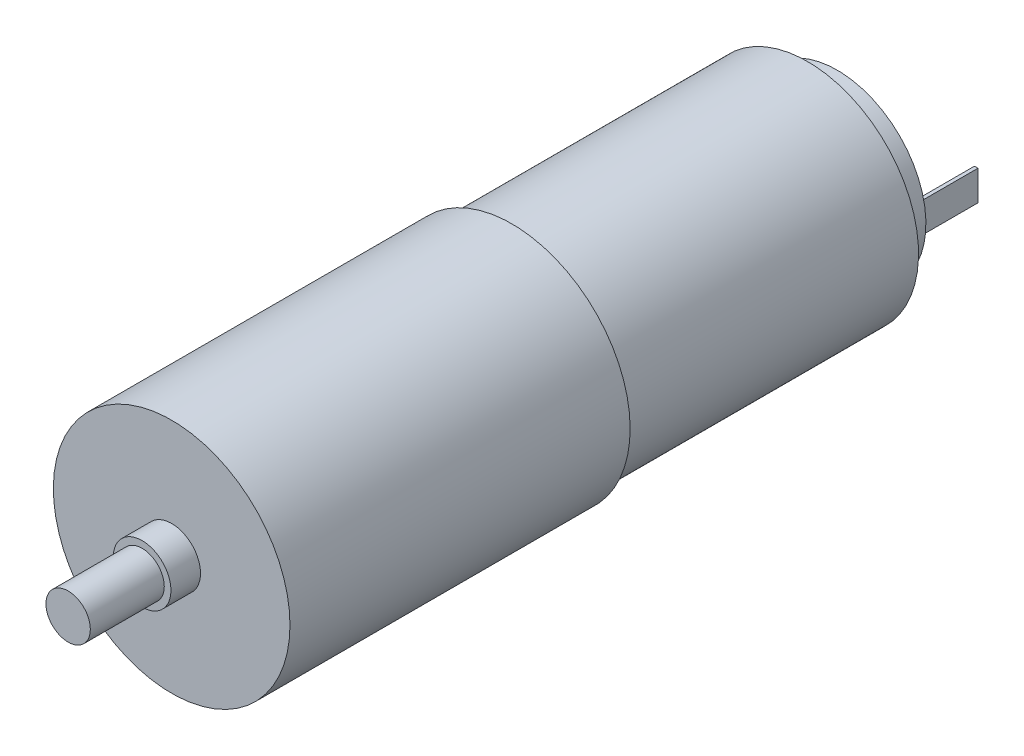
ISO-10303-21;
HEADER;
FILE_DESCRIPTION(('STEP AP214'),'2;1');
FILE_NAME('part.step','',(''),(''),'','','');
FILE_SCHEMA(('AUTOMOTIVE_DESIGN { 1 0 10303 214 1 1 1 1 }'));
ENDSEC;
DATA;
#1=APPLICATION_CONTEXT('core data for automotive mechanical design processes');
#2=APPLICATION_PROTOCOL_DEFINITION('international standard','automotive_design',2000,#1);
#3=PRODUCT_CONTEXT('',#1,'mechanical');
#4=PRODUCT('Part','Part','',(#3));
#5=PRODUCT_RELATED_PRODUCT_CATEGORY('part','',(#4));
#6=PRODUCT_DEFINITION_FORMATION('','',#4);
#7=PRODUCT_DEFINITION_CONTEXT('part definition',#1,'design');
#8=PRODUCT_DEFINITION('design','',#6,#7);
#9=PRODUCT_DEFINITION_SHAPE('','',#8);
#10=(LENGTH_UNIT() NAMED_UNIT(*) SI_UNIT(.MILLI.,.METRE.));
#11=(NAMED_UNIT(*) PLANE_ANGLE_UNIT() SI_UNIT($,.RADIAN.));
#12=(NAMED_UNIT(*) SI_UNIT($,.STERADIAN.) SOLID_ANGLE_UNIT());
#13=UNCERTAINTY_MEASURE_WITH_UNIT(LENGTH_MEASURE(1.E-05),#10,'distance_accuracy_value','');
#14=(GEOMETRIC_REPRESENTATION_CONTEXT(3) GLOBAL_UNCERTAINTY_ASSIGNED_CONTEXT((#13)) GLOBAL_UNIT_ASSIGNED_CONTEXT((#10,
#11,#12)) REPRESENTATION_CONTEXT('',''));
#15=CARTESIAN_POINT('',(0.,0.,0.));
#16=DIRECTION('',(0.,0.,1.));
#17=DIRECTION('',(1.,0.,0.));
#18=AXIS2_PLACEMENT_3D('',#15,#16,#17);
#19=CARTESIAN_POINT('',(0.,0.,-22.));
#20=DIRECTION('',(0.,0.,-1.));
#21=DIRECTION('',(-1.,0.,0.));
#22=AXIS2_PLACEMENT_3D('',#19,#20,#21);
#23=PLANE('',#22);
#24=CARTESIAN_POINT('',(0.,0.,-22.));
#25=DIRECTION('',(0.,0.,-1.));
#26=DIRECTION('',(-1.,0.,0.));
#27=AXIS2_PLACEMENT_3D('',#24,#25,#26);
#28=CIRCLE('',#27,6.);
#29=CARTESIAN_POINT('',(-6.,0.,-22.));
#30=VERTEX_POINT('',#29);
#31=EDGE_CURVE('E216',#30,#30,#28,.T.);
#32=ORIENTED_EDGE('',*,*,#31,.T.);
#33=EDGE_LOOP('',(#32));
#34=FACE_BOUND('',#33,.T.);
#35=DIRECTION('',(1.,0.,0.));
#36=VECTOR('',#35,1.);
#37=CARTESIAN_POINT('',(5.52102003642987,1.01467395264138,-22.));
#38=LINE('',#37,#36);
#39=CARTESIAN_POINT('',(5.28227322404372,1.01467395264138,-22.));
#40=VERTEX_POINT('',#39);
#41=CARTESIAN_POINT('',(5.52102003642987,1.01467395264138,-22.));
#42=VERTEX_POINT('',#41);
#43=EDGE_CURVE('E159',#40,#42,#38,.T.);
#44=ORIENTED_EDGE('',*,*,#43,.F.);
#45=DIRECTION('',(0.,1.,0.));
#46=VECTOR('',#45,1.);
#47=CARTESIAN_POINT('',(5.28227322404372,-1.01467395264138,-22.));
#48=LINE('',#47,#46);
#49=CARTESIAN_POINT('',(5.28227322404372,-1.01467395264138,-22.));
#50=VERTEX_POINT('',#49);
#51=EDGE_CURVE('E156',#50,#40,#48,.T.);
#52=ORIENTED_EDGE('',*,*,#51,.F.);
#53=DIRECTION('',(-1.,0.,0.));
#54=VECTOR('',#53,1.);
#55=CARTESIAN_POINT('',(5.52102003642987,-1.01467395264138,-22.));
#56=LINE('',#55,#54);
#57=CARTESIAN_POINT('',(5.52102003642987,-1.01467395264138,-22.));
#58=VERTEX_POINT('',#57);
#59=EDGE_CURVE('E168',#58,#50,#56,.T.);
#60=ORIENTED_EDGE('',*,*,#59,.F.);
#61=DIRECTION('',(0.,-1.,0.));
#62=VECTOR('',#61,1.);
#63=CARTESIAN_POINT('',(5.52102003642987,-1.01467395264138,-22.));
#64=LINE('',#63,#62);
#65=EDGE_CURVE('E176',#42,#58,#64,.T.);
#66=ORIENTED_EDGE('',*,*,#65,.F.);
#67=EDGE_LOOP('',(#44,#52,#60,#66));
#68=FACE_BOUND('',#67,.T.);
#69=DIRECTION('',(1.,0.,0.));
#70=VECTOR('',#69,1.);
#71=CARTESIAN_POINT('',(-5.26735154826958,1.01467395264138,-22.));
#72=LINE('',#71,#70);
#73=CARTESIAN_POINT('',(-5.47625500910747,1.01467395264138,-22.));
#74=VERTEX_POINT('',#73);
#75=CARTESIAN_POINT('',(-5.26735154826958,1.01467395264138,-22.));
#76=VERTEX_POINT('',#75);
#77=EDGE_CURVE('E266',#74,#76,#72,.T.);
#78=ORIENTED_EDGE('',*,*,#77,.F.);
#79=DIRECTION('',(0.,1.,0.));
#80=VECTOR('',#79,1.);
#81=CARTESIAN_POINT('',(-5.47625500910747,-1.01467395264138,-22.));
#82=LINE('',#81,#80);
#83=CARTESIAN_POINT('',(-5.47625500910747,-1.01467395264138,-22.));
#84=VERTEX_POINT('',#83);
#85=EDGE_CURVE('E154',#84,#74,#82,.T.);
#86=ORIENTED_EDGE('',*,*,#85,.F.);
#87=DIRECTION('',(-1.,0.,0.));
#88=VECTOR('',#87,1.);
#89=CARTESIAN_POINT('',(-5.26735154826958,-1.01467395264138,-22.));
#90=LINE('',#89,#88);
#91=CARTESIAN_POINT('',(-5.26735154826958,-1.01467395264138,-22.));
#92=VERTEX_POINT('',#91);
#93=EDGE_CURVE('E150',#92,#84,#90,.T.);
#94=ORIENTED_EDGE('',*,*,#93,.F.);
#95=DIRECTION('',(0.,-1.,0.));
#96=VECTOR('',#95,1.);
#97=CARTESIAN_POINT('',(-5.26735154826958,-1.01467395264138,-22.));
#98=LINE('',#97,#96);
#99=EDGE_CURVE('E268',#76,#92,#98,.T.);
#100=ORIENTED_EDGE('',*,*,#99,.F.);
#101=EDGE_LOOP('',(#78,#86,#94,#100));
#102=FACE_BOUND('',#101,.T.);
#103=ADVANCED_FACE('F37',(#34,#68,#102),#23,.T.);
#104=CARTESIAN_POINT('',(0.,0.,23.));
#105=DIRECTION('',(0.,0.,-1.));
#106=DIRECTION('',(-1.,0.,0.));
#107=AXIS2_PLACEMENT_3D('',#104,#105,#106);
#108=CYLINDRICAL_SURFACE('',#107,8.);
#109=CARTESIAN_POINT('',(0.,0.,23.));
#110=DIRECTION('',(0.,0.,1.));
#111=DIRECTION('',(1.,0.,0.));
#112=AXIS2_PLACEMENT_3D('',#109,#110,#111);
#113=CIRCLE('',#112,8.);
#114=CARTESIAN_POINT('',(8.,0.,23.));
#115=VERTEX_POINT('',#114);
#116=EDGE_CURVE('E221',#115,#115,#113,.T.);
#117=ORIENTED_EDGE('',*,*,#116,.F.);
#118=EDGE_LOOP('',(#117));
#119=FACE_BOUND('',#118,.T.);
#120=CARTESIAN_POINT('',(0.,0.,5.));
#121=DIRECTION('',(0.,0.,1.));
#122=DIRECTION('',(1.,0.,0.));
#123=AXIS2_PLACEMENT_3D('',#120,#121,#122);
#124=CIRCLE('',#123,8.);
#125=CARTESIAN_POINT('',(-5.29150262212918,-6.,5.));
#126=VERTEX_POINT('',#125);
#127=CARTESIAN_POINT('',(5.29150262212918,-6.,5.));
#128=VERTEX_POINT('',#127);
#129=EDGE_CURVE('E41',#126,#128,#124,.T.);
#130=ORIENTED_EDGE('',*,*,#129,.T.);
#131=DIRECTION('',(0.,0.,-1.));
#132=VECTOR('',#131,1.);
#133=CARTESIAN_POINT('',(5.29150262212918,-6.,23.));
#134=LINE('',#133,#132);
#135=CARTESIAN_POINT('',(5.29150262212918,-6.,0.));
#136=VERTEX_POINT('',#135);
#137=EDGE_CURVE('E199',#128,#136,#134,.T.);
#138=ORIENTED_EDGE('',*,*,#137,.T.);
#139=CARTESIAN_POINT('',(0.,0.,0.));
#140=DIRECTION('',(0.,0.,1.));
#141=DIRECTION('',(1.,0.,0.));
#142=AXIS2_PLACEMENT_3D('',#139,#140,#141);
#143=CIRCLE('',#142,8.);
#144=CARTESIAN_POINT('',(-5.29150262212918,-6.,0.));
#145=VERTEX_POINT('',#144);
#146=EDGE_CURVE('E224',#136,#145,#143,.T.);
#147=ORIENTED_EDGE('',*,*,#146,.T.);
#148=DIRECTION('',(0.,0.,-1.));
#149=VECTOR('',#148,1.);
#150=CARTESIAN_POINT('',(-5.29150262212918,-6.,23.));
#151=LINE('',#150,#149);
#152=EDGE_CURVE('E206',#145,#126,#151,.F.);
#153=ORIENTED_EDGE('',*,*,#152,.T.);
#154=EDGE_LOOP('',(#130,#138,#147,#153));
#155=FACE_BOUND('',#154,.T.);
#156=ADVANCED_FACE('F39',(#119,#155),#108,.T.);
#157=CARTESIAN_POINT('',(0.,0.,23.));
#158=DIRECTION('',(0.,0.,1.));
#159=DIRECTION('',(1.,0.,0.));
#160=AXIS2_PLACEMENT_3D('',#157,#158,#159);
#161=PLANE('',#160);
#162=CARTESIAN_POINT('',(0.,0.,23.));
#163=DIRECTION('',(0.,0.,1.));
#164=DIRECTION('',(1.,0.,0.));
#165=AXIS2_PLACEMENT_3D('',#162,#163,#164);
#166=CIRCLE('',#165,1.95);
#167=CARTESIAN_POINT('',(1.95,0.,23.));
#168=VERTEX_POINT('',#167);
#169=EDGE_CURVE('E217',#168,#168,#166,.T.);
#170=ORIENTED_EDGE('',*,*,#169,.F.);
#171=EDGE_LOOP('',(#170));
#172=FACE_BOUND('',#171,.T.);
#173=ORIENTED_EDGE('',*,*,#116,.T.);
#174=EDGE_LOOP('',(#173));
#175=FACE_BOUND('',#174,.T.);
#176=ADVANCED_FACE('F302',(#172,#175),#161,.T.);
#177=CARTESIAN_POINT('',(0.,0.,0.));
#178=DIRECTION('',(0.,0.,1.));
#179=DIRECTION('',(1.,0.,0.));
#180=AXIS2_PLACEMENT_3D('',#177,#178,#179);
#181=PLANE('',#180);
#182=ORIENTED_EDGE('',*,*,#146,.F.);
#183=DIRECTION('',(-1.,0.,0.));
#184=VECTOR('',#183,1.);
#185=CARTESIAN_POINT('',(0.,-6.,0.));
#186=LINE('',#185,#184);
#187=CARTESIAN_POINT('',(4.5,-6.,0.));
#188=VERTEX_POINT('',#187);
#189=EDGE_CURVE('E196',#136,#188,#186,.T.);
#190=ORIENTED_EDGE('',*,*,#189,.T.);
#191=CARTESIAN_POINT('',(0.,0.,0.));
#192=DIRECTION('',(0.,0.,1.));
#193=DIRECTION('',(1.,0.,0.));
#194=AXIS2_PLACEMENT_3D('',#191,#192,#193);
#195=CIRCLE('',#194,7.5);
#196=CARTESIAN_POINT('',(-4.5,-6.,0.));
#197=VERTEX_POINT('',#196);
#198=EDGE_CURVE('E220',#197,#188,#195,.F.);
#199=ORIENTED_EDGE('',*,*,#198,.F.);
#200=EDGE_CURVE('E200',#197,#145,#186,.T.);
#201=ORIENTED_EDGE('',*,*,#200,.T.);
#202=EDGE_LOOP('',(#182,#190,#199,#201));
#203=FACE_BOUND('',#202,.T.);
#204=ADVANCED_FACE('F243',(#203),#181,.F.);
#205=CARTESIAN_POINT('',(0.,0.,25.));
#206=DIRECTION('',(0.,0.,-1.));
#207=DIRECTION('',(-1.,0.,0.));
#208=AXIS2_PLACEMENT_3D('',#205,#206,#207);
#209=CYLINDRICAL_SURFACE('',#208,1.95);
#210=CARTESIAN_POINT('',(0.,0.,25.));
#211=DIRECTION('',(0.,0.,1.));
#212=DIRECTION('',(1.,0.,0.));
#213=AXIS2_PLACEMENT_3D('',#210,#211,#212);
#214=CIRCLE('',#213,1.95);
#215=CARTESIAN_POINT('',(1.95,0.,25.));
#216=VERTEX_POINT('',#215);
#217=EDGE_CURVE('E213',#216,#216,#214,.T.);
#218=ORIENTED_EDGE('',*,*,#217,.F.);
#219=EDGE_LOOP('',(#218));
#220=FACE_BOUND('',#219,.T.);
#221=ORIENTED_EDGE('',*,*,#169,.T.);
#222=EDGE_LOOP('',(#221));
#223=FACE_BOUND('',#222,.T.);
#224=ADVANCED_FACE('F293',(#220,#223),#209,.T.);
#225=CARTESIAN_POINT('',(0.,0.,25.));
#226=DIRECTION('',(0.,0.,1.));
#227=DIRECTION('',(1.,0.,0.));
#228=AXIS2_PLACEMENT_3D('',#225,#226,#227);
#229=PLANE('',#228);
#230=CARTESIAN_POINT('',(0.,0.,25.));
#231=DIRECTION('',(0.,0.,1.));
#232=DIRECTION('',(1.,0.,0.));
#233=AXIS2_PLACEMENT_3D('',#230,#231,#232);
#234=CIRCLE('',#233,1.5);
#235=CARTESIAN_POINT('',(1.5,0.,25.));
#236=VERTEX_POINT('',#235);
#237=EDGE_CURVE('E11',#236,#236,#234,.T.);
#238=ORIENTED_EDGE('',*,*,#237,.F.);
#239=EDGE_LOOP('',(#238));
#240=FACE_BOUND('',#239,.T.);
#241=ORIENTED_EDGE('',*,*,#217,.T.);
#242=EDGE_LOOP('',(#241));
#243=FACE_BOUND('',#242,.T.);
#244=ADVANCED_FACE('F290',(#240,#243),#229,.T.);
#245=CARTESIAN_POINT('',(0.,0.,-20.));
#246=DIRECTION('',(0.,0.,1.));
#247=DIRECTION('',(1.,0.,0.));
#248=AXIS2_PLACEMENT_3D('',#245,#246,#247);
#249=CYLINDRICAL_SURFACE('',#248,7.5);
#250=CARTESIAN_POINT('',(0.,0.,-20.));
#251=DIRECTION('',(0.,0.,-1.));
#252=DIRECTION('',(-1.,0.,0.));
#253=AXIS2_PLACEMENT_3D('',#250,#251,#252);
#254=CIRCLE('',#253,7.5);
#255=CARTESIAN_POINT('',(-4.5,-6.,-20.));
#256=VERTEX_POINT('',#255);
#257=CARTESIAN_POINT('',(4.5,-6.,-20.));
#258=VERTEX_POINT('',#257);
#259=EDGE_CURVE('E209',#256,#258,#254,.T.);
#260=ORIENTED_EDGE('',*,*,#259,.F.);
#261=DIRECTION('',(0.,0.,1.));
#262=VECTOR('',#261,1.);
#263=CARTESIAN_POINT('',(-4.5,-6.,-20.));
#264=LINE('',#263,#262);
#265=EDGE_CURVE('E203',#256,#197,#264,.T.);
#266=ORIENTED_EDGE('',*,*,#265,.T.);
#267=ORIENTED_EDGE('',*,*,#198,.T.);
#268=DIRECTION('',(0.,0.,1.));
#269=VECTOR('',#268,1.);
#270=CARTESIAN_POINT('',(4.5,-6.,-20.));
#271=LINE('',#270,#269);
#272=EDGE_CURVE('E191',#188,#258,#271,.F.);
#273=ORIENTED_EDGE('',*,*,#272,.T.);
#274=EDGE_LOOP('',(#260,#266,#267,#273));
#275=FACE_BOUND('',#274,.T.);
#276=ADVANCED_FACE('F246',(#275),#249,.T.);
#277=CARTESIAN_POINT('',(0.,0.,-20.));
#278=DIRECTION('',(0.,0.,-1.));
#279=DIRECTION('',(-1.,0.,0.));
#280=AXIS2_PLACEMENT_3D('',#277,#278,#279);
#281=PLANE('',#280);
#282=DIRECTION('',(1.,0.,0.));
#283=VECTOR('',#282,1.);
#284=CARTESIAN_POINT('',(0.,-6.,-20.));
#285=LINE('',#284,#283);
#286=CARTESIAN_POINT('',(0.,-6.,-20.));
#287=VERTEX_POINT('',#286);
#288=EDGE_CURVE('E192',#256,#287,#285,.T.);
#289=ORIENTED_EDGE('',*,*,#288,.F.);
#290=ORIENTED_EDGE('',*,*,#259,.T.);
#291=EDGE_CURVE('E187',#287,#258,#285,.T.);
#292=ORIENTED_EDGE('',*,*,#291,.F.);
#293=CARTESIAN_POINT('',(0.,0.,-20.));
#294=DIRECTION('',(0.,0.,-1.));
#295=DIRECTION('',(-1.,0.,0.));
#296=AXIS2_PLACEMENT_3D('',#293,#294,#295);
#297=CIRCLE('',#296,6.);
#298=EDGE_CURVE('E212',#287,#287,#297,.T.);
#299=ORIENTED_EDGE('',*,*,#298,.F.);
#300=EDGE_LOOP('',(#289,#290,#292,#299));
#301=FACE_BOUND('',#300,.T.);
#302=ADVANCED_FACE('F249',(#301),#281,.T.);
#303=CARTESIAN_POINT('',(0.,0.,-22.));
#304=DIRECTION('',(0.,0.,1.));
#305=DIRECTION('',(1.,0.,0.));
#306=AXIS2_PLACEMENT_3D('',#303,#304,#305);
#307=CYLINDRICAL_SURFACE('',#306,6.);
#308=ORIENTED_EDGE('',*,*,#298,.T.);
#309=EDGE_LOOP('',(#308));
#310=FACE_BOUND('',#309,.T.);
#311=ORIENTED_EDGE('',*,*,#31,.F.);
#312=EDGE_LOOP('',(#311));
#313=FACE_BOUND('',#312,.T.);
#314=ADVANCED_FACE('F252',(#310,#313),#307,.T.);
#315=CARTESIAN_POINT('',(0.,0.,5.));
#316=DIRECTION('',(0.,0.,1.));
#317=DIRECTION('',(1.,0.,0.));
#318=AXIS2_PLACEMENT_3D('',#315,#316,#317);
#319=PLANE('',#318);
#320=DIRECTION('',(1.,0.,0.));
#321=VECTOR('',#320,1.);
#322=CARTESIAN_POINT('',(7.07287431693989,-6.,5.));
#323=LINE('',#322,#321);
#324=EDGE_CURVE('E188',#126,#128,#323,.T.);
#325=ORIENTED_EDGE('',*,*,#324,.T.);
#326=ORIENTED_EDGE('',*,*,#129,.F.);
#327=EDGE_LOOP('',(#325,#326));
#328=FACE_BOUND('',#327,.T.);
#329=ADVANCED_FACE('F238',(#328),#319,.F.);
#330=CARTESIAN_POINT('',(0.,-6.,5.));
#331=DIRECTION('',(0.,1.,0.));
#332=DIRECTION('',(0.,0.,1.));
#333=AXIS2_PLACEMENT_3D('',#330,#331,#332);
#334=PLANE('',#333);
#335=ORIENTED_EDGE('',*,*,#200,.F.);
#336=ORIENTED_EDGE('',*,*,#265,.F.);
#337=ORIENTED_EDGE('',*,*,#288,.T.);
#338=ORIENTED_EDGE('',*,*,#291,.T.);
#339=ORIENTED_EDGE('',*,*,#272,.F.);
#340=ORIENTED_EDGE('',*,*,#189,.F.);
#341=ORIENTED_EDGE('',*,*,#137,.F.);
#342=ORIENTED_EDGE('',*,*,#324,.F.);
#343=ORIENTED_EDGE('',*,*,#152,.F.);
#344=EDGE_LOOP('',(#335,#336,#337,#338,#339,#340,#341,#342,#343));
#345=FACE_BOUND('',#344,.T.);
#346=ADVANCED_FACE('F240',(#345),#334,.F.);
#347=CARTESIAN_POINT('',(5.28227322404372,-1.01467395264138,-26.));
#348=DIRECTION('',(1.,0.,0.));
#349=DIRECTION('',(0.,0.,-1.));
#350=AXIS2_PLACEMENT_3D('',#347,#348,#349);
#351=PLANE('',#350);
#352=ORIENTED_EDGE('',*,*,#51,.T.);
#353=DIRECTION('',(0.,0.,1.));
#354=VECTOR('',#353,1.);
#355=CARTESIAN_POINT('',(5.28227322404372,1.01467395264138,-26.));
#356=LINE('',#355,#354);
#357=CARTESIAN_POINT('',(5.28227322404372,1.01467395264138,-26.));
#358=VERTEX_POINT('',#357);
#359=EDGE_CURVE('E185',#358,#40,#356,.T.);
#360=ORIENTED_EDGE('',*,*,#359,.F.);
#361=DIRECTION('',(0.,1.,0.));
#362=VECTOR('',#361,1.);
#363=CARTESIAN_POINT('',(5.28227322404372,-1.01467395264138,-26.));
#364=LINE('',#363,#362);
#365=CARTESIAN_POINT('',(5.28227322404372,-1.01467395264138,-26.));
#366=VERTEX_POINT('',#365);
#367=EDGE_CURVE('E164',#366,#358,#364,.T.);
#368=ORIENTED_EDGE('',*,*,#367,.F.);
#369=DIRECTION('',(0.,0.,1.));
#370=VECTOR('',#369,1.);
#371=CARTESIAN_POINT('',(5.28227322404372,-1.01467395264138,-26.));
#372=LINE('',#371,#370);
#373=EDGE_CURVE('E173',#366,#50,#372,.T.);
#374=ORIENTED_EDGE('',*,*,#373,.T.);
#375=EDGE_LOOP('',(#352,#360,#368,#374));
#376=FACE_BOUND('',#375,.T.);
#377=ADVANCED_FACE('F360',(#376),#351,.F.);
#378=CARTESIAN_POINT('',(5.52102003642987,1.01467395264138,-26.));
#379=DIRECTION('',(0.,-1.,0.));
#380=DIRECTION('',(0.,0.,-1.));
#381=AXIS2_PLACEMENT_3D('',#378,#379,#380);
#382=PLANE('',#381);
#383=ORIENTED_EDGE('',*,*,#43,.T.);
#384=DIRECTION('',(0.,0.,1.));
#385=VECTOR('',#384,1.);
#386=CARTESIAN_POINT('',(5.52102003642987,1.01467395264138,-26.));
#387=LINE('',#386,#385);
#388=CARTESIAN_POINT('',(5.52102003642987,1.01467395264138,-26.));
#389=VERTEX_POINT('',#388);
#390=EDGE_CURVE('E182',#389,#42,#387,.T.);
#391=ORIENTED_EDGE('',*,*,#390,.F.);
#392=DIRECTION('',(1.,0.,0.));
#393=VECTOR('',#392,1.);
#394=CARTESIAN_POINT('',(5.52102003642987,1.01467395264138,-26.));
#395=LINE('',#394,#393);
#396=EDGE_CURVE('E167',#358,#389,#395,.T.);
#397=ORIENTED_EDGE('',*,*,#396,.F.);
#398=ORIENTED_EDGE('',*,*,#359,.T.);
#399=EDGE_LOOP('',(#383,#391,#397,#398));
#400=FACE_BOUND('',#399,.T.);
#401=ADVANCED_FACE('F368',(#400),#382,.F.);
#402=CARTESIAN_POINT('',(5.52102003642987,-1.01467395264138,-26.));
#403=DIRECTION('',(-1.,0.,0.));
#404=DIRECTION('',(0.,0.,1.));
#405=AXIS2_PLACEMENT_3D('',#402,#403,#404);
#406=PLANE('',#405);
#407=ORIENTED_EDGE('',*,*,#65,.T.);
#408=DIRECTION('',(0.,0.,1.));
#409=VECTOR('',#408,1.);
#410=CARTESIAN_POINT('',(5.52102003642987,-1.01467395264138,-26.));
#411=LINE('',#410,#409);
#412=CARTESIAN_POINT('',(5.52102003642987,-1.01467395264138,-26.));
#413=VERTEX_POINT('',#412);
#414=EDGE_CURVE('E61',#413,#58,#411,.T.);
#415=ORIENTED_EDGE('',*,*,#414,.F.);
#416=DIRECTION('',(0.,-1.,0.));
#417=VECTOR('',#416,1.);
#418=CARTESIAN_POINT('',(5.52102003642987,-1.01467395264138,-26.));
#419=LINE('',#418,#417);
#420=EDGE_CURVE('E170',#389,#413,#419,.T.);
#421=ORIENTED_EDGE('',*,*,#420,.F.);
#422=ORIENTED_EDGE('',*,*,#390,.T.);
#423=EDGE_LOOP('',(#407,#415,#421,#422));
#424=FACE_BOUND('',#423,.T.);
#425=ADVANCED_FACE('F376',(#424),#406,.F.);
#426=CARTESIAN_POINT('',(5.52102003642987,-1.01467395264138,-26.));
#427=DIRECTION('',(0.,1.,0.));
#428=DIRECTION('',(0.,0.,1.));
#429=AXIS2_PLACEMENT_3D('',#426,#427,#428);
#430=PLANE('',#429);
#431=ORIENTED_EDGE('',*,*,#59,.T.);
#432=ORIENTED_EDGE('',*,*,#373,.F.);
#433=DIRECTION('',(-1.,0.,0.));
#434=VECTOR('',#433,1.);
#435=CARTESIAN_POINT('',(5.52102003642987,-1.01467395264138,-26.));
#436=LINE('',#435,#434);
#437=EDGE_CURVE('E172',#413,#366,#436,.T.);
#438=ORIENTED_EDGE('',*,*,#437,.F.);
#439=ORIENTED_EDGE('',*,*,#414,.T.);
#440=EDGE_LOOP('',(#431,#432,#438,#439));
#441=FACE_BOUND('',#440,.T.);
#442=ADVANCED_FACE('F384',(#441),#430,.F.);
#443=CARTESIAN_POINT('',(0.,0.,-26.));
#444=DIRECTION('',(0.,0.,1.));
#445=DIRECTION('',(1.,0.,0.));
#446=AXIS2_PLACEMENT_3D('',#443,#444,#445);
#447=PLANE('',#446);
#448=ORIENTED_EDGE('',*,*,#367,.T.);
#449=ORIENTED_EDGE('',*,*,#396,.T.);
#450=ORIENTED_EDGE('',*,*,#420,.T.);
#451=ORIENTED_EDGE('',*,*,#437,.T.);
#452=EDGE_LOOP('',(#448,#449,#450,#451));
#453=FACE_BOUND('',#452,.T.);
#454=ADVANCED_FACE('F392',(#453),#447,.F.);
#455=CARTESIAN_POINT('',(-5.47625500910747,-1.01467395264138,-26.));
#456=DIRECTION('',(1.,0.,0.));
#457=DIRECTION('',(0.,0.,-1.));
#458=AXIS2_PLACEMENT_3D('',#455,#456,#457);
#459=PLANE('',#458);
#460=ORIENTED_EDGE('',*,*,#85,.T.);
#461=DIRECTION('',(0.,0.,1.));
#462=VECTOR('',#461,1.);
#463=CARTESIAN_POINT('',(-5.47625500910747,1.01467395264138,-26.));
#464=LINE('',#463,#462);
#465=CARTESIAN_POINT('',(-5.47625500910747,1.01467395264138,-26.));
#466=VERTEX_POINT('',#465);
#467=EDGE_CURVE('E135',#466,#74,#464,.T.);
#468=ORIENTED_EDGE('',*,*,#467,.F.);
#469=DIRECTION('',(0.,1.,0.));
#470=VECTOR('',#469,1.);
#471=CARTESIAN_POINT('',(-5.47625500910747,-1.01467395264138,-26.));
#472=LINE('',#471,#470);
#473=CARTESIAN_POINT('',(-5.47625500910747,-1.01467395264138,-26.));
#474=VERTEX_POINT('',#473);
#475=EDGE_CURVE('E142',#474,#466,#472,.T.);
#476=ORIENTED_EDGE('',*,*,#475,.F.);
#477=DIRECTION('',(0.,0.,1.));
#478=VECTOR('',#477,1.);
#479=CARTESIAN_POINT('',(-5.47625500910747,-1.01467395264138,-26.));
#480=LINE('',#479,#478);
#481=EDGE_CURVE('E276',#474,#84,#480,.T.);
#482=ORIENTED_EDGE('',*,*,#481,.T.);
#483=EDGE_LOOP('',(#460,#468,#476,#482));
#484=FACE_BOUND('',#483,.T.);
#485=ADVANCED_FACE('F152',(#484),#459,.F.);
#486=CARTESIAN_POINT('',(-5.26735154826958,1.01467395264138,-26.));
#487=DIRECTION('',(0.,-1.,0.));
#488=DIRECTION('',(0.,0.,-1.));
#489=AXIS2_PLACEMENT_3D('',#486,#487,#488);
#490=PLANE('',#489);
#491=ORIENTED_EDGE('',*,*,#77,.T.);
#492=DIRECTION('',(0.,0.,1.));
#493=VECTOR('',#492,1.);
#494=CARTESIAN_POINT('',(-5.26735154826958,1.01467395264138,-26.));
#495=LINE('',#494,#493);
#496=CARTESIAN_POINT('',(-5.26735154826958,1.01467395264138,-26.));
#497=VERTEX_POINT('',#496);
#498=EDGE_CURVE('E138',#497,#76,#495,.T.);
#499=ORIENTED_EDGE('',*,*,#498,.F.);
#500=DIRECTION('',(1.,0.,0.));
#501=VECTOR('',#500,1.);
#502=CARTESIAN_POINT('',(-5.26735154826958,1.01467395264138,-26.));
#503=LINE('',#502,#501);
#504=EDGE_CURVE('E131',#466,#497,#503,.T.);
#505=ORIENTED_EDGE('',*,*,#504,.F.);
#506=ORIENTED_EDGE('',*,*,#467,.T.);
#507=EDGE_LOOP('',(#491,#499,#505,#506));
#508=FACE_BOUND('',#507,.T.);
#509=ADVANCED_FACE('F133',(#508),#490,.F.);
#510=CARTESIAN_POINT('',(-5.26735154826958,-1.01467395264138,-26.));
#511=DIRECTION('',(-1.,0.,0.));
#512=DIRECTION('',(0.,0.,1.));
#513=AXIS2_PLACEMENT_3D('',#510,#511,#512);
#514=PLANE('',#513);
#515=ORIENTED_EDGE('',*,*,#99,.T.);
#516=DIRECTION('',(0.,0.,1.));
#517=VECTOR('',#516,1.);
#518=CARTESIAN_POINT('',(-5.26735154826958,-1.01467395264138,-26.));
#519=LINE('',#518,#517);
#520=CARTESIAN_POINT('',(-5.26735154826958,-1.01467395264138,-26.));
#521=VERTEX_POINT('',#520);
#522=EDGE_CURVE('E53',#521,#92,#519,.T.);
#523=ORIENTED_EDGE('',*,*,#522,.F.);
#524=DIRECTION('',(0.,-1.,0.));
#525=VECTOR('',#524,1.);
#526=CARTESIAN_POINT('',(-5.26735154826958,-1.01467395264138,-26.));
#527=LINE('',#526,#525);
#528=EDGE_CURVE('E141',#497,#521,#527,.T.);
#529=ORIENTED_EDGE('',*,*,#528,.F.);
#530=ORIENTED_EDGE('',*,*,#498,.T.);
#531=EDGE_LOOP('',(#515,#523,#529,#530));
#532=FACE_BOUND('',#531,.T.);
#533=ADVANCED_FACE('F412',(#532),#514,.F.);
#534=CARTESIAN_POINT('',(-5.26735154826958,-1.01467395264138,-26.));
#535=DIRECTION('',(0.,1.,0.));
#536=DIRECTION('',(0.,0.,1.));
#537=AXIS2_PLACEMENT_3D('',#534,#535,#536);
#538=PLANE('',#537);
#539=ORIENTED_EDGE('',*,*,#93,.T.);
#540=ORIENTED_EDGE('',*,*,#481,.F.);
#541=DIRECTION('',(-1.,0.,0.));
#542=VECTOR('',#541,1.);
#543=CARTESIAN_POINT('',(-5.26735154826958,-1.01467395264138,-26.));
#544=LINE('',#543,#542);
#545=EDGE_CURVE('E146',#521,#474,#544,.T.);
#546=ORIENTED_EDGE('',*,*,#545,.F.);
#547=ORIENTED_EDGE('',*,*,#522,.T.);
#548=EDGE_LOOP('',(#539,#540,#546,#547));
#549=FACE_BOUND('',#548,.T.);
#550=ADVANCED_FACE('F419',(#549),#538,.F.);
#551=CARTESIAN_POINT('',(0.,0.,-26.));
#552=DIRECTION('',(0.,0.,1.));
#553=DIRECTION('',(1.,0.,0.));
#554=AXIS2_PLACEMENT_3D('',#551,#552,#553);
#555=PLANE('',#554);
#556=ORIENTED_EDGE('',*,*,#475,.T.);
#557=ORIENTED_EDGE('',*,*,#504,.T.);
#558=ORIENTED_EDGE('',*,*,#528,.T.);
#559=ORIENTED_EDGE('',*,*,#545,.T.);
#560=EDGE_LOOP('',(#556,#557,#558,#559));
#561=FACE_BOUND('',#560,.T.);
#562=ADVANCED_FACE('F145',(#561),#555,.F.);
#563=CARTESIAN_POINT('',(0.,0.,30.));
#564=DIRECTION('',(0.,0.,-1.));
#565=DIRECTION('',(-1.,0.,0.));
#566=AXIS2_PLACEMENT_3D('',#563,#564,#565);
#567=CYLINDRICAL_SURFACE('',#566,1.5);
#568=CARTESIAN_POINT('',(0.,0.,30.));
#569=DIRECTION('',(0.,0.,1.));
#570=DIRECTION('',(1.,0.,0.));
#571=AXIS2_PLACEMENT_3D('',#568,#569,#570);
#572=CIRCLE('',#571,1.5);
#573=CARTESIAN_POINT('',(1.5,0.,30.));
#574=VERTEX_POINT('',#573);
#575=EDGE_CURVE('E271',#574,#574,#572,.T.);
#576=ORIENTED_EDGE('',*,*,#575,.F.);
#577=EDGE_LOOP('',(#576));
#578=FACE_BOUND('',#577,.T.);
#579=ORIENTED_EDGE('',*,*,#237,.T.);
#580=EDGE_LOOP('',(#579));
#581=FACE_BOUND('',#580,.T.);
#582=ADVANCED_FACE('F284',(#578,#581),#567,.T.);
#583=CARTESIAN_POINT('',(0.,0.,30.));
#584=DIRECTION('',(0.,0.,1.));
#585=DIRECTION('',(1.,0.,0.));
#586=AXIS2_PLACEMENT_3D('',#583,#584,#585);
#587=PLANE('',#586);
#588=ORIENTED_EDGE('',*,*,#575,.T.);
#589=EDGE_LOOP('',(#588));
#590=FACE_BOUND('',#589,.T.);
#591=ADVANCED_FACE('F282',(#590),#587,.T.);
#592=CLOSED_SHELL('',(#103,#156,#176,#204,#224,#244,#276,#302,#314,#329,#346,#377,#401,#425,
#442,#454,#485,#509,#533,#550,#562,#582,#591));
#593=MANIFOLD_SOLID_BREP('B2',#592);
#594=ADVANCED_BREP_SHAPE_REPRESENTATION('',(#18,#593),#14);
#595=SHAPE_DEFINITION_REPRESENTATION(#9,#594);
ENDSEC;
END-ISO-10303-21;
